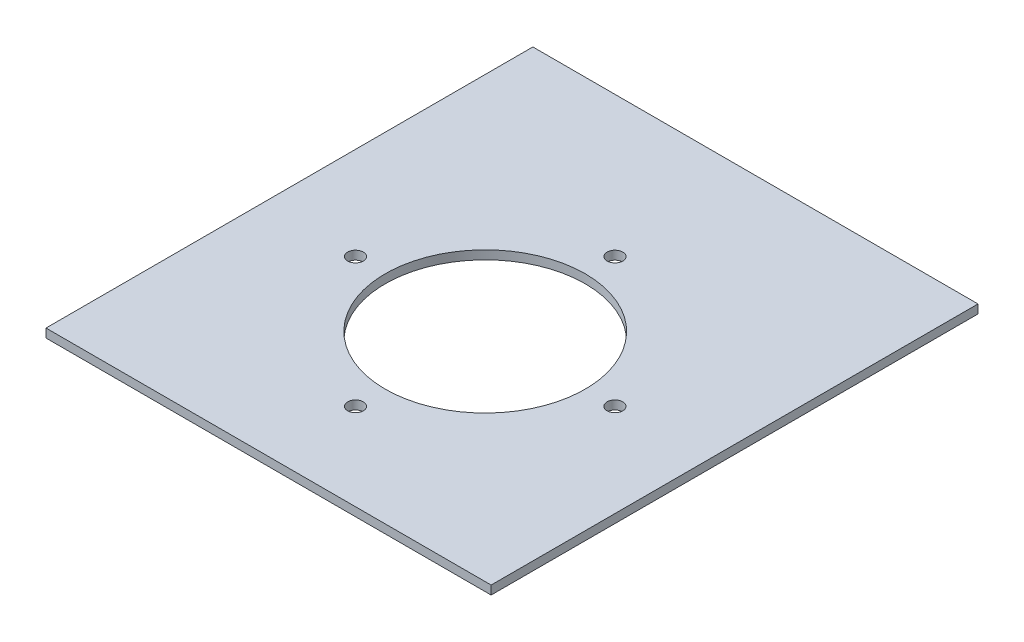
ISO-10303-21;
HEADER;
FILE_DESCRIPTION(('STEP AP214'),'2;1');
FILE_NAME('part.step','',(''),(''),'','','');
FILE_SCHEMA(('AUTOMOTIVE_DESIGN { 1 0 10303 214 1 1 1 1 }'));
ENDSEC;
DATA;
#1=APPLICATION_CONTEXT('core data for automotive mechanical design processes');
#2=APPLICATION_PROTOCOL_DEFINITION('international standard','automotive_design',2000,#1);
#3=PRODUCT_CONTEXT('',#1,'mechanical');
#4=PRODUCT('Part','Part','',(#3));
#5=PRODUCT_RELATED_PRODUCT_CATEGORY('part','',(#4));
#6=PRODUCT_DEFINITION_FORMATION('','',#4);
#7=PRODUCT_DEFINITION_CONTEXT('part definition',#1,'design');
#8=PRODUCT_DEFINITION('design','',#6,#7);
#9=PRODUCT_DEFINITION_SHAPE('','',#8);
#10=(LENGTH_UNIT() NAMED_UNIT(*) SI_UNIT(.MILLI.,.METRE.));
#11=(NAMED_UNIT(*) PLANE_ANGLE_UNIT() SI_UNIT($,.RADIAN.));
#12=(NAMED_UNIT(*) SI_UNIT($,.STERADIAN.) SOLID_ANGLE_UNIT());
#13=UNCERTAINTY_MEASURE_WITH_UNIT(LENGTH_MEASURE(1.E-05),#10,'distance_accuracy_value','');
#14=(GEOMETRIC_REPRESENTATION_CONTEXT(3) GLOBAL_UNCERTAINTY_ASSIGNED_CONTEXT((#13)) GLOBAL_UNIT_ASSIGNED_CONTEXT((#10,
#11,#12)) REPRESENTATION_CONTEXT('',''));
#15=CARTESIAN_POINT('',(0.,0.,0.));
#16=DIRECTION('',(0.,0.,1.));
#17=DIRECTION('',(1.,0.,0.));
#18=AXIS2_PLACEMENT_3D('',#15,#16,#17);
#19=CARTESIAN_POINT('',(0.,5.,0.));
#20=DIRECTION('',(1.,0.,0.));
#21=DIRECTION('',(0.,0.,-1.));
#22=AXIS2_PLACEMENT_3D('',#19,#20,#21);
#23=PLANE('',#22);
#24=DIRECTION('',(0.,0.,1.));
#25=VECTOR('',#24,1.);
#26=CARTESIAN_POINT('',(0.,0.,0.));
#27=LINE('',#26,#25);
#28=CARTESIAN_POINT('',(0.,0.,-280.));
#29=VERTEX_POINT('',#28);
#30=CARTESIAN_POINT('',(0.,0.,0.));
#31=VERTEX_POINT('',#30);
#32=EDGE_CURVE('E96',#29,#31,#27,.T.);
#33=ORIENTED_EDGE('',*,*,#32,.T.);
#34=DIRECTION('',(0.,-1.,0.));
#35=VECTOR('',#34,1.);
#36=CARTESIAN_POINT('',(0.,5.,0.));
#37=LINE('',#36,#35);
#38=CARTESIAN_POINT('',(0.,5.,0.));
#39=VERTEX_POINT('',#38);
#40=EDGE_CURVE('E11',#39,#31,#37,.T.);
#41=ORIENTED_EDGE('',*,*,#40,.F.);
#42=DIRECTION('',(0.,0.,1.));
#43=VECTOR('',#42,1.);
#44=CARTESIAN_POINT('',(0.,5.,0.));
#45=LINE('',#44,#43);
#46=CARTESIAN_POINT('',(0.,5.,-280.));
#47=VERTEX_POINT('',#46);
#48=EDGE_CURVE('E84',#47,#39,#45,.T.);
#49=ORIENTED_EDGE('',*,*,#48,.F.);
#50=DIRECTION('',(0.,-1.,0.));
#51=VECTOR('',#50,1.);
#52=CARTESIAN_POINT('',(0.,5.,-280.));
#53=LINE('',#52,#51);
#54=EDGE_CURVE('E92',#47,#29,#53,.T.);
#55=ORIENTED_EDGE('',*,*,#54,.T.);
#56=EDGE_LOOP('',(#33,#41,#49,#55));
#57=FACE_BOUND('',#56,.T.);
#58=ADVANCED_FACE('F33',(#57),#23,.F.);
#59=CARTESIAN_POINT('',(0.,5.,0.));
#60=DIRECTION('',(0.,0.,-1.));
#61=DIRECTION('',(-1.,0.,0.));
#62=AXIS2_PLACEMENT_3D('',#59,#60,#61);
#63=PLANE('',#62);
#64=DIRECTION('',(1.,0.,0.));
#65=VECTOR('',#64,1.);
#66=CARTESIAN_POINT('',(0.,0.,0.));
#67=LINE('',#66,#65);
#68=CARTESIAN_POINT('',(256.,0.,0.));
#69=VERTEX_POINT('',#68);
#70=EDGE_CURVE('E88',#31,#69,#67,.T.);
#71=ORIENTED_EDGE('',*,*,#70,.T.);
#72=DIRECTION('',(0.,-1.,0.));
#73=VECTOR('',#72,1.);
#74=CARTESIAN_POINT('',(256.,5.,0.));
#75=LINE('',#74,#73);
#76=CARTESIAN_POINT('',(256.,5.,0.));
#77=VERTEX_POINT('',#76);
#78=EDGE_CURVE('E41',#77,#69,#75,.T.);
#79=ORIENTED_EDGE('',*,*,#78,.F.);
#80=DIRECTION('',(1.,0.,0.));
#81=VECTOR('',#80,1.);
#82=CARTESIAN_POINT('',(0.,5.,0.));
#83=LINE('',#82,#81);
#84=EDGE_CURVE('E79',#39,#77,#83,.T.);
#85=ORIENTED_EDGE('',*,*,#84,.F.);
#86=ORIENTED_EDGE('',*,*,#40,.T.);
#87=EDGE_LOOP('',(#71,#79,#85,#86));
#88=FACE_BOUND('',#87,.T.);
#89=ADVANCED_FACE('F87',(#88),#63,.F.);
#90=CARTESIAN_POINT('',(256.,5.,0.));
#91=DIRECTION('',(-1.,0.,0.));
#92=DIRECTION('',(0.,0.,1.));
#93=AXIS2_PLACEMENT_3D('',#90,#91,#92);
#94=PLANE('',#93);
#95=DIRECTION('',(0.,0.,-1.));
#96=VECTOR('',#95,1.);
#97=CARTESIAN_POINT('',(256.,0.,0.));
#98=LINE('',#97,#96);
#99=CARTESIAN_POINT('',(256.,0.,-280.));
#100=VERTEX_POINT('',#99);
#101=EDGE_CURVE('E66',#69,#100,#98,.T.);
#102=ORIENTED_EDGE('',*,*,#101,.T.);
#103=DIRECTION('',(0.,-1.,0.));
#104=VECTOR('',#103,1.);
#105=CARTESIAN_POINT('',(256.,5.,-280.));
#106=LINE('',#105,#104);
#107=CARTESIAN_POINT('',(256.,5.,-280.));
#108=VERTEX_POINT('',#107);
#109=EDGE_CURVE('E89',#108,#100,#106,.T.);
#110=ORIENTED_EDGE('',*,*,#109,.F.);
#111=DIRECTION('',(0.,0.,-1.));
#112=VECTOR('',#111,1.);
#113=CARTESIAN_POINT('',(256.,5.,0.));
#114=LINE('',#113,#112);
#115=EDGE_CURVE('E82',#77,#108,#114,.T.);
#116=ORIENTED_EDGE('',*,*,#115,.F.);
#117=ORIENTED_EDGE('',*,*,#78,.T.);
#118=EDGE_LOOP('',(#102,#110,#116,#117));
#119=FACE_BOUND('',#118,.T.);
#120=ADVANCED_FACE('F90',(#119),#94,.F.);
#121=CARTESIAN_POINT('',(0.,5.,-280.));
#122=DIRECTION('',(0.,0.,1.));
#123=DIRECTION('',(1.,0.,0.));
#124=AXIS2_PLACEMENT_3D('',#121,#122,#123);
#125=PLANE('',#124);
#126=DIRECTION('',(-1.,0.,0.));
#127=VECTOR('',#126,1.);
#128=CARTESIAN_POINT('',(0.,0.,-280.));
#129=LINE('',#128,#127);
#130=EDGE_CURVE('E72',#100,#29,#129,.T.);
#131=ORIENTED_EDGE('',*,*,#130,.T.);
#132=ORIENTED_EDGE('',*,*,#54,.F.);
#133=DIRECTION('',(-1.,0.,0.));
#134=VECTOR('',#133,1.);
#135=CARTESIAN_POINT('',(0.,5.,-280.));
#136=LINE('',#135,#134);
#137=EDGE_CURVE('E49',#108,#47,#136,.T.);
#138=ORIENTED_EDGE('',*,*,#137,.F.);
#139=ORIENTED_EDGE('',*,*,#109,.T.);
#140=EDGE_LOOP('',(#131,#132,#138,#139));
#141=FACE_BOUND('',#140,.T.);
#142=ADVANCED_FACE('F104',(#141),#125,.F.);
#143=CARTESIAN_POINT('',(0.,5.,0.));
#144=DIRECTION('',(0.,-1.,0.));
#145=DIRECTION('',(0.,0.,-1.));
#146=AXIS2_PLACEMENT_3D('',#143,#144,#145);
#147=PLANE('',#146);
#148=CARTESIAN_POINT('',(128.,5.,-199.2));
#149=DIRECTION('',(0.,1.,0.));
#150=DIRECTION('',(0.,0.,1.));
#151=AXIS2_PLACEMENT_3D('',#148,#149,#150);
#152=CIRCLE('',#151,4.5);
#153=CARTESIAN_POINT('',(128.,5.,-194.7));
#154=VERTEX_POINT('',#153);
#155=EDGE_CURVE('E123',#154,#154,#152,.T.);
#156=ORIENTED_EDGE('',*,*,#155,.F.);
#157=EDGE_LOOP('',(#156));
#158=FACE_BOUND('',#157,.T.);
#159=CARTESIAN_POINT('',(53.4,5.,-124.6));
#160=DIRECTION('',(0.,1.,0.));
#161=DIRECTION('',(0.,0.,1.));
#162=AXIS2_PLACEMENT_3D('',#159,#160,#161);
#163=CIRCLE('',#162,4.49999999999999);
#164=CARTESIAN_POINT('',(53.4,5.,-120.1));
#165=VERTEX_POINT('',#164);
#166=EDGE_CURVE('E124',#165,#165,#163,.T.);
#167=ORIENTED_EDGE('',*,*,#166,.F.);
#168=EDGE_LOOP('',(#167));
#169=FACE_BOUND('',#168,.T.);
#170=CARTESIAN_POINT('',(128.,5.,-50.));
#171=DIRECTION('',(0.,1.,0.));
#172=DIRECTION('',(0.,0.,1.));
#173=AXIS2_PLACEMENT_3D('',#170,#171,#172);
#174=CIRCLE('',#173,4.49999999999999);
#175=CARTESIAN_POINT('',(128.,5.,-45.5));
#176=VERTEX_POINT('',#175);
#177=EDGE_CURVE('E130',#176,#176,#174,.T.);
#178=ORIENTED_EDGE('',*,*,#177,.F.);
#179=EDGE_LOOP('',(#178));
#180=FACE_BOUND('',#179,.T.);
#181=CARTESIAN_POINT('',(202.6,5.,-124.6));
#182=DIRECTION('',(0.,1.,0.));
#183=DIRECTION('',(0.,0.,1.));
#184=AXIS2_PLACEMENT_3D('',#181,#182,#183);
#185=CIRCLE('',#184,4.49999999999999);
#186=CARTESIAN_POINT('',(202.6,5.,-120.1));
#187=VERTEX_POINT('',#186);
#188=EDGE_CURVE('E110',#187,#187,#185,.T.);
#189=ORIENTED_EDGE('',*,*,#188,.F.);
#190=EDGE_LOOP('',(#189));
#191=FACE_BOUND('',#190,.T.);
#192=CARTESIAN_POINT('',(128.,5.,-124.6));
#193=DIRECTION('',(0.,1.,0.));
#194=DIRECTION('',(0.,0.,1.));
#195=AXIS2_PLACEMENT_3D('',#192,#193,#194);
#196=CIRCLE('',#195,57.5);
#197=CARTESIAN_POINT('',(128.,5.,-67.1));
#198=VERTEX_POINT('',#197);
#199=EDGE_CURVE('E117',#198,#198,#196,.T.);
#200=ORIENTED_EDGE('',*,*,#199,.F.);
#201=EDGE_LOOP('',(#200));
#202=FACE_BOUND('',#201,.T.);
#203=ORIENTED_EDGE('',*,*,#48,.T.);
#204=ORIENTED_EDGE('',*,*,#84,.T.);
#205=ORIENTED_EDGE('',*,*,#115,.T.);
#206=ORIENTED_EDGE('',*,*,#137,.T.);
#207=EDGE_LOOP('',(#203,#204,#205,#206));
#208=FACE_BOUND('',#207,.T.);
#209=ADVANCED_FACE('F80',(#158,#169,#180,#191,#202,#208),#147,.F.);
#210=CARTESIAN_POINT('',(0.,0.,0.));
#211=DIRECTION('',(0.,-1.,0.));
#212=DIRECTION('',(0.,0.,-1.));
#213=AXIS2_PLACEMENT_3D('',#210,#211,#212);
#214=PLANE('',#213);
#215=CARTESIAN_POINT('',(128.,0.,-199.2));
#216=DIRECTION('',(0.,1.,0.));
#217=DIRECTION('',(0.,0.,1.));
#218=AXIS2_PLACEMENT_3D('',#215,#216,#217);
#219=CIRCLE('',#218,4.5);
#220=CARTESIAN_POINT('',(128.,0.,-194.7));
#221=VERTEX_POINT('',#220);
#222=EDGE_CURVE('E99',#221,#221,#219,.T.);
#223=ORIENTED_EDGE('',*,*,#222,.T.);
#224=EDGE_LOOP('',(#223));
#225=FACE_BOUND('',#224,.T.);
#226=CARTESIAN_POINT('',(53.4,0.,-124.6));
#227=DIRECTION('',(0.,1.,0.));
#228=DIRECTION('',(0.,0.,1.));
#229=AXIS2_PLACEMENT_3D('',#226,#227,#228);
#230=CIRCLE('',#229,4.49999999999999);
#231=CARTESIAN_POINT('',(53.4,0.,-120.1));
#232=VERTEX_POINT('',#231);
#233=EDGE_CURVE('E127',#232,#232,#230,.T.);
#234=ORIENTED_EDGE('',*,*,#233,.T.);
#235=EDGE_LOOP('',(#234));
#236=FACE_BOUND('',#235,.T.);
#237=CARTESIAN_POINT('',(128.,0.,-50.));
#238=DIRECTION('',(0.,1.,0.));
#239=DIRECTION('',(0.,0.,1.));
#240=AXIS2_PLACEMENT_3D('',#237,#238,#239);
#241=CIRCLE('',#240,4.49999999999999);
#242=CARTESIAN_POINT('',(128.,0.,-45.5));
#243=VERTEX_POINT('',#242);
#244=EDGE_CURVE('E114',#243,#243,#241,.T.);
#245=ORIENTED_EDGE('',*,*,#244,.T.);
#246=EDGE_LOOP('',(#245));
#247=FACE_BOUND('',#246,.T.);
#248=CARTESIAN_POINT('',(202.6,0.,-124.6));
#249=DIRECTION('',(0.,1.,0.));
#250=DIRECTION('',(0.,0.,1.));
#251=AXIS2_PLACEMENT_3D('',#248,#249,#250);
#252=CIRCLE('',#251,4.49999999999999);
#253=CARTESIAN_POINT('',(202.6,0.,-120.1));
#254=VERTEX_POINT('',#253);
#255=EDGE_CURVE('E113',#254,#254,#252,.T.);
#256=ORIENTED_EDGE('',*,*,#255,.T.);
#257=EDGE_LOOP('',(#256));
#258=FACE_BOUND('',#257,.T.);
#259=CARTESIAN_POINT('',(128.,0.,-124.6));
#260=DIRECTION('',(0.,1.,0.));
#261=DIRECTION('',(0.,0.,1.));
#262=AXIS2_PLACEMENT_3D('',#259,#260,#261);
#263=CIRCLE('',#262,57.5);
#264=CARTESIAN_POINT('',(128.,0.,-67.1));
#265=VERTEX_POINT('',#264);
#266=EDGE_CURVE('E120',#265,#265,#263,.T.);
#267=ORIENTED_EDGE('',*,*,#266,.T.);
#268=EDGE_LOOP('',(#267));
#269=FACE_BOUND('',#268,.T.);
#270=ORIENTED_EDGE('',*,*,#32,.F.);
#271=ORIENTED_EDGE('',*,*,#130,.F.);
#272=ORIENTED_EDGE('',*,*,#101,.F.);
#273=ORIENTED_EDGE('',*,*,#70,.F.);
#274=EDGE_LOOP('',(#270,#271,#272,#273));
#275=FACE_BOUND('',#274,.T.);
#276=ADVANCED_FACE('F107',(#225,#236,#247,#258,#269,#275),#214,.T.);
#277=CARTESIAN_POINT('',(128.,0.,-124.6));
#278=DIRECTION('',(0.,1.,0.));
#279=DIRECTION('',(0.,0.,1.));
#280=AXIS2_PLACEMENT_3D('',#277,#278,#279);
#281=CYLINDRICAL_SURFACE('',#280,57.5);
#282=ORIENTED_EDGE('',*,*,#266,.F.);
#283=EDGE_LOOP('',(#282));
#284=FACE_BOUND('',#283,.T.);
#285=ORIENTED_EDGE('',*,*,#199,.T.);
#286=EDGE_LOOP('',(#285));
#287=FACE_BOUND('',#286,.T.);
#288=ADVANCED_FACE('F160',(#284,#287),#281,.F.);
#289=CARTESIAN_POINT('',(202.6,0.,-124.6));
#290=DIRECTION('',(0.,1.,0.));
#291=DIRECTION('',(0.,0.,1.));
#292=AXIS2_PLACEMENT_3D('',#289,#290,#291);
#293=CYLINDRICAL_SURFACE('',#292,4.49999999999999);
#294=ORIENTED_EDGE('',*,*,#255,.F.);
#295=EDGE_LOOP('',(#294));
#296=FACE_BOUND('',#295,.T.);
#297=ORIENTED_EDGE('',*,*,#188,.T.);
#298=EDGE_LOOP('',(#297));
#299=FACE_BOUND('',#298,.T.);
#300=ADVANCED_FACE('F162',(#296,#299),#293,.F.);
#301=CARTESIAN_POINT('',(128.,0.,-50.));
#302=DIRECTION('',(0.,1.,0.));
#303=DIRECTION('',(0.,0.,1.));
#304=AXIS2_PLACEMENT_3D('',#301,#302,#303);
#305=CYLINDRICAL_SURFACE('',#304,4.49999999999999);
#306=ORIENTED_EDGE('',*,*,#244,.F.);
#307=EDGE_LOOP('',(#306));
#308=FACE_BOUND('',#307,.T.);
#309=ORIENTED_EDGE('',*,*,#177,.T.);
#310=EDGE_LOOP('',(#309));
#311=FACE_BOUND('',#310,.T.);
#312=ADVANCED_FACE('F169',(#308,#311),#305,.F.);
#313=CARTESIAN_POINT('',(53.4,0.,-124.6));
#314=DIRECTION('',(0.,1.,0.));
#315=DIRECTION('',(0.,0.,1.));
#316=AXIS2_PLACEMENT_3D('',#313,#314,#315);
#317=CYLINDRICAL_SURFACE('',#316,4.49999999999999);
#318=ORIENTED_EDGE('',*,*,#233,.F.);
#319=EDGE_LOOP('',(#318));
#320=FACE_BOUND('',#319,.T.);
#321=ORIENTED_EDGE('',*,*,#166,.T.);
#322=EDGE_LOOP('',(#321));
#323=FACE_BOUND('',#322,.T.);
#324=ADVANCED_FACE('F145',(#320,#323),#317,.F.);
#325=CARTESIAN_POINT('',(128.,0.,-199.2));
#326=DIRECTION('',(0.,1.,0.));
#327=DIRECTION('',(0.,0.,1.));
#328=AXIS2_PLACEMENT_3D('',#325,#326,#327);
#329=CYLINDRICAL_SURFACE('',#328,4.5);
#330=ORIENTED_EDGE('',*,*,#222,.F.);
#331=EDGE_LOOP('',(#330));
#332=FACE_BOUND('',#331,.T.);
#333=ORIENTED_EDGE('',*,*,#155,.T.);
#334=EDGE_LOOP('',(#333));
#335=FACE_BOUND('',#334,.T.);
#336=ADVANCED_FACE('F142',(#332,#335),#329,.F.);
#337=CLOSED_SHELL('',(#58,#89,#120,#142,#209,#276,#288,#300,#312,#324,#336));
#338=MANIFOLD_SOLID_BREP('B2',#337);
#339=ADVANCED_BREP_SHAPE_REPRESENTATION('',(#18,#338),#14);
#340=SHAPE_DEFINITION_REPRESENTATION(#9,#339);
ENDSEC;
END-ISO-10303-21;
